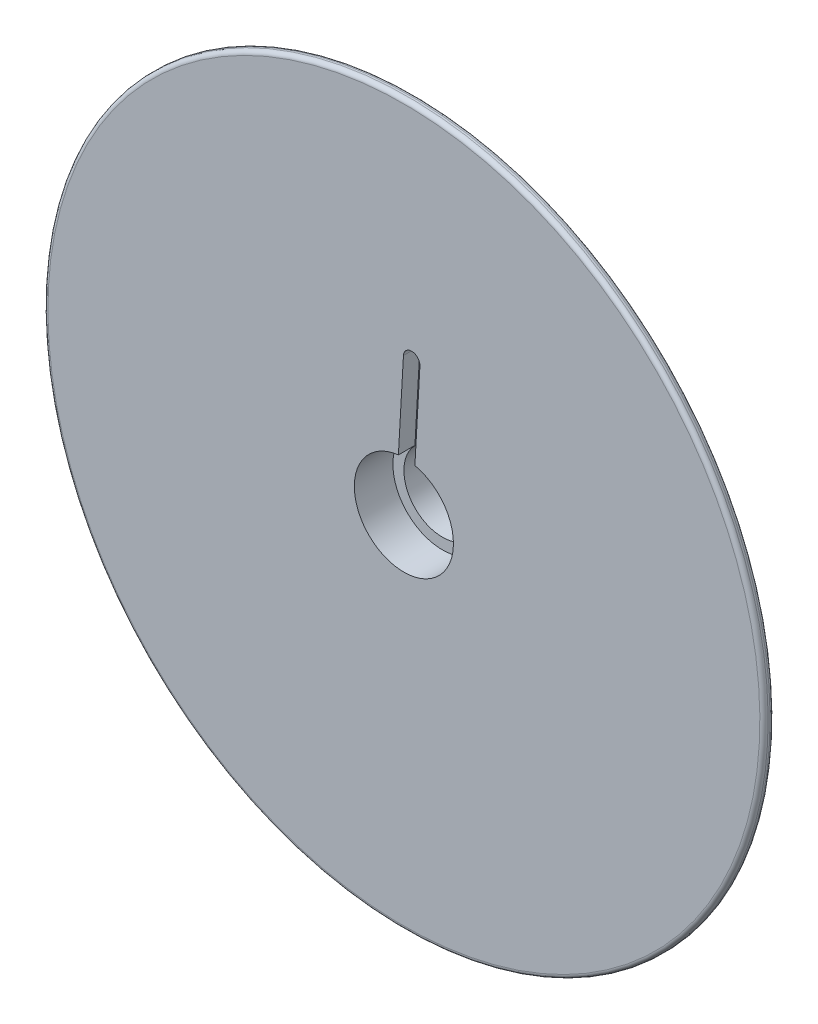
ISO-10303-21;
HEADER;
FILE_DESCRIPTION(('STEP AP214'),'2;1');
FILE_NAME('part.step','',(''),(''),'','','');
FILE_SCHEMA(('AUTOMOTIVE_DESIGN { 1 0 10303 214 1 1 1 1 }'));
ENDSEC;
DATA;
#1=APPLICATION_CONTEXT('core data for automotive mechanical design processes');
#2=APPLICATION_PROTOCOL_DEFINITION('international standard','automotive_design',2000,#1);
#3=PRODUCT_CONTEXT('',#1,'mechanical');
#4=PRODUCT('Part','Part','',(#3));
#5=PRODUCT_RELATED_PRODUCT_CATEGORY('part','',(#4));
#6=PRODUCT_DEFINITION_FORMATION('','',#4);
#7=PRODUCT_DEFINITION_CONTEXT('part definition',#1,'design');
#8=PRODUCT_DEFINITION('design','',#6,#7);
#9=PRODUCT_DEFINITION_SHAPE('','',#8);
#10=(LENGTH_UNIT() NAMED_UNIT(*) SI_UNIT(.MILLI.,.METRE.));
#11=(NAMED_UNIT(*) PLANE_ANGLE_UNIT() SI_UNIT($,.RADIAN.));
#12=(NAMED_UNIT(*) SI_UNIT($,.STERADIAN.) SOLID_ANGLE_UNIT());
#13=UNCERTAINTY_MEASURE_WITH_UNIT(LENGTH_MEASURE(1.E-05),#10,'distance_accuracy_value','');
#14=(GEOMETRIC_REPRESENTATION_CONTEXT(3) GLOBAL_UNCERTAINTY_ASSIGNED_CONTEXT((#13)) GLOBAL_UNIT_ASSIGNED_CONTEXT((#10,
#11,#12)) REPRESENTATION_CONTEXT('',''));
#15=CARTESIAN_POINT('',(0.,0.,0.));
#16=DIRECTION('',(0.,0.,1.));
#17=DIRECTION('',(1.,0.,0.));
#18=AXIS2_PLACEMENT_3D('',#15,#16,#17);
#19=CARTESIAN_POINT('',(60.,0.,69.));
#20=DIRECTION('',(0.,0.,-1.));
#21=DIRECTION('',(0.0567306240548655,0.998389521326394,0.));
#22=AXIS2_PLACEMENT_3D('',#19,#20,#21);
#23=CYLINDRICAL_SURFACE('',#22,7.);
#24=CARTESIAN_POINT('',(60.,0.,36.));
#25=DIRECTION('',(0.,0.,-1.));
#26=DIRECTION('',(0.0567306240548655,0.998389521326394,0.));
#27=AXIS2_PLACEMENT_3D('',#24,#25,#26);
#28=CIRCLE('',#27,7.);
#29=CARTESIAN_POINT('',(60.3971143683841,6.98872664928476,36.));
#30=VERTEX_POINT('',#29);
#31=EDGE_CURVE('E93',#30,#30,#28,.T.);
#32=ORIENTED_EDGE('',*,*,#31,.T.);
#33=EDGE_LOOP('',(#32));
#34=FACE_BOUND('',#33,.T.);
#35=CARTESIAN_POINT('',(60.,0.,51.));
#36=DIRECTION('',(0.,0.,1.));
#37=DIRECTION('',(-0.0567306240548655,-0.998389521326394,0.));
#38=AXIS2_PLACEMENT_3D('',#35,#36,#37);
#39=CIRCLE('',#38,7.);
#40=CARTESIAN_POINT('',(59.6028856316159,-6.98872664928476,51.));
#41=VERTEX_POINT('',#40);
#42=EDGE_CURVE('E98',#41,#41,#39,.F.);
#43=ORIENTED_EDGE('',*,*,#42,.F.);
#44=EDGE_LOOP('',(#43));
#45=FACE_BOUND('',#44,.T.);
#46=ADVANCED_FACE('F40',(#34,#45),#23,.F.);
#47=CARTESIAN_POINT('',(60.,0.,36.));
#48=DIRECTION('',(0.,0.,1.));
#49=DIRECTION('',(0.998389521326394,-0.0567306240548655,0.));
#50=AXIS2_PLACEMENT_3D('',#47,#48,#49);
#51=PLANE('',#50);
#52=ORIENTED_EDGE('',*,*,#31,.F.);
#53=EDGE_LOOP('',(#52));
#54=FACE_BOUND('',#53,.T.);
#55=CARTESIAN_POINT('',(60.,0.,36.));
#56=DIRECTION('',(0.,0.,1.));
#57=DIRECTION('',(0.998389521326394,-0.0567306240548655,0.));
#58=AXIS2_PLACEMENT_3D('',#55,#56,#57);
#59=CIRCLE('',#58,9.5);
#60=CARTESIAN_POINT('',(69.4847004526007,-0.538940928521224,36.));
#61=VERTEX_POINT('',#60);
#62=EDGE_CURVE('E109',#61,#61,#59,.T.);
#63=ORIENTED_EDGE('',*,*,#62,.F.);
#64=EDGE_LOOP('',(#63));
#65=FACE_BOUND('',#64,.T.);
#66=ADVANCED_FACE('F144',(#54,#65),#51,.F.);
#67=CARTESIAN_POINT('',(60.,0.,58.));
#68=DIRECTION('',(0.,0.,1.));
#69=DIRECTION('',(0.998389521326394,-0.0567306240548655,0.));
#70=AXIS2_PLACEMENT_3D('',#67,#68,#69);
#71=CYLINDRICAL_SURFACE('',#70,9.5);
#72=CARTESIAN_POINT('',(60.,0.,45.));
#73=DIRECTION('',(0.,0.,1.));
#74=DIRECTION('',(0.998389521326394,-0.0567306240548655,0.));
#75=AXIS2_PLACEMENT_3D('',#72,#73,#74);
#76=CIRCLE('',#75,9.5);
#77=CARTESIAN_POINT('',(69.4847004526008,-0.538940928521224,45.));
#78=VERTEX_POINT('',#77);
#79=EDGE_CURVE('E12',#78,#78,#76,.F.);
#80=ORIENTED_EDGE('',*,*,#79,.T.);
#81=EDGE_LOOP('',(#80));
#82=FACE_BOUND('',#81,.T.);
#83=ORIENTED_EDGE('',*,*,#62,.T.);
#84=EDGE_LOOP('',(#83));
#85=FACE_BOUND('',#84,.T.);
#86=ADVANCED_FACE('F150',(#82,#85),#71,.T.);
#87=CARTESIAN_POINT('',(60.5389409285212,9.48470045260074,53.));
#88=DIRECTION('',(0.,0.,1.));
#89=DIRECTION('',(0.998389521326394,-0.0567306240548655,0.));
#90=AXIS2_PLACEMENT_3D('',#87,#88,#89);
#91=PLANE('',#90);
#92=CARTESIAN_POINT('',(60.,0.,53.));
#93=DIRECTION('',(0.,0.,1.));
#94=DIRECTION('',(0.998389521326394,-0.0567306240548655,0.));
#95=AXIS2_PLACEMENT_3D('',#92,#93,#94);
#96=CIRCLE('',#95,39.5);
#97=CARTESIAN_POINT('',(99.4363860923926,-2.24085965016719,53.));
#98=VERTEX_POINT('',#97);
#99=EDGE_CURVE('E48',#98,#98,#96,.T.);
#100=ORIENTED_EDGE('',*,*,#99,.T.);
#101=EDGE_LOOP('',(#100));
#102=FACE_BOUND('',#101,.T.);
#103=CARTESIAN_POINT('',(60.,0.,53.));
#104=DIRECTION('',(0.,0.,1.));
#105=DIRECTION('',(0.998389521326394,-0.0567306240548655,0.));
#106=AXIS2_PLACEMENT_3D('',#103,#104,#105);
#107=CIRCLE('',#106,60.4);
#108=CARTESIAN_POINT('',(120.302727088114,-3.42652969291388,53.));
#109=VERTEX_POINT('',#108);
#110=EDGE_CURVE('E113',#109,#109,#107,.F.);
#111=ORIENTED_EDGE('',*,*,#110,.T.);
#112=EDGE_LOOP('',(#111));
#113=FACE_BOUND('',#112,.T.);
#114=ADVANCED_FACE('F131',(#102,#113),#91,.F.);
#115=CARTESIAN_POINT('',(60.,0.,58.));
#116=DIRECTION('',(0.,0.,1.));
#117=DIRECTION('',(0.998389521326394,-0.0567306240548655,0.));
#118=AXIS2_PLACEMENT_3D('',#115,#116,#117);
#119=CYLINDRICAL_SURFACE('',#118,65.4);
#120=CARTESIAN_POINT('',(60.,0.,57.25));
#121=DIRECTION('',(0.,0.,-1.));
#122=DIRECTION('',(-0.998389521326394,0.0567306240548655,0.));
#123=AXIS2_PLACEMENT_3D('',#120,#121,#122);
#124=CIRCLE('',#123,65.4);
#125=CARTESIAN_POINT('',(-5.29467469474616,3.7101828131882,57.25));
#126=VERTEX_POINT('',#125);
#127=EDGE_CURVE('E123',#126,#126,#124,.T.);
#128=ORIENTED_EDGE('',*,*,#127,.T.);
#129=EDGE_LOOP('',(#128));
#130=FACE_BOUND('',#129,.T.);
#131=CARTESIAN_POINT('',(60.,0.,56.89049167118));
#132=DIRECTION('',(0.,0.,-1.));
#133=DIRECTION('',(-0.998389521326394,0.0567306240548655,0.));
#134=AXIS2_PLACEMENT_3D('',#131,#132,#133);
#135=CIRCLE('',#134,65.4);
#136=CARTESIAN_POINT('',(-5.29467469474616,3.7101828131882,56.8904916711801));
#137=VERTEX_POINT('',#136);
#138=EDGE_CURVE('E120',#137,#137,#135,.F.);
#139=ORIENTED_EDGE('',*,*,#138,.T.);
#140=EDGE_LOOP('',(#139));
#141=FACE_BOUND('',#140,.T.);
#142=ADVANCED_FACE('F159',(#130,#141),#119,.T.);
#143=CARTESIAN_POINT('',(63.7101828131882,65.2946746947462,58.));
#144=DIRECTION('',(0.,0.,-1.));
#145=DIRECTION('',(-0.998389521326394,0.0567306240548655,0.));
#146=AXIS2_PLACEMENT_3D('',#143,#144,#145);
#147=PLANE('',#146);
#148=CARTESIAN_POINT('',(60.,0.,58.));
#149=DIRECTION('',(0.,0.,-1.));
#150=DIRECTION('',(-0.998389521326394,0.0567306240548655,0.));
#151=AXIS2_PLACEMENT_3D('',#148,#149,#150);
#152=CIRCLE('',#151,64.65);
#153=CARTESIAN_POINT('',(-4.54588255375136,3.66763484514705,58.));
#154=VERTEX_POINT('',#153);
#155=EDGE_CURVE('E117',#154,#154,#152,.F.);
#156=ORIENTED_EDGE('',*,*,#155,.T.);
#157=EDGE_LOOP('',(#156));
#158=FACE_BOUND('',#157,.T.);
#159=DIRECTION('',(0.0567306240548654,0.998389521326394,0.));
#160=VECTOR('',#159,1.);
#161=CARTESIAN_POINT('',(62.9158498833612,24.8746420970775,58.));
#162=LINE('',#161,#160);
#163=CARTESIAN_POINT('',(62.00101862907,8.77473215808407,58.));
#164=VERTEX_POINT('',#163);
#165=CARTESIAN_POINT('',(62.9158498833612,24.8746420970775,58.));
#166=VERTEX_POINT('',#165);
#167=EDGE_CURVE('E76',#164,#166,#162,.T.);
#168=ORIENTED_EDGE('',*,*,#167,.F.);
#169=CARTESIAN_POINT('',(60.,0.,58.));
#170=DIRECTION('',(0.,0.,1.));
#171=DIRECTION('',(-0.0567306240548655,-0.998389521326394,0.));
#172=AXIS2_PLACEMENT_3D('',#169,#170,#171);
#173=CIRCLE('',#172,9.);
#174=CARTESIAN_POINT('',(59.0058500650908,8.94492403024867,58.));
#175=VERTEX_POINT('',#174);
#176=EDGE_CURVE('E336',#175,#164,#173,.T.);
#177=ORIENTED_EDGE('',*,*,#176,.F.);
#178=DIRECTION('',(-0.0567306240548654,-0.998389521326394,0.));
#179=VECTOR('',#178,1.);
#180=CARTESIAN_POINT('',(59.9206813193821,25.0448339692421,58.));
#181=LINE('',#180,#179);
#182=CARTESIAN_POINT('',(59.9206813193821,25.0448339692421,58.));
#183=VERTEX_POINT('',#182);
#184=EDGE_CURVE('E86',#183,#175,#181,.T.);
#185=ORIENTED_EDGE('',*,*,#184,.F.);
#186=CARTESIAN_POINT('',(61.4182656013716,24.9597380331598,58.));
#187=DIRECTION('',(0.,0.,1.));
#188=DIRECTION('',(-0.0567306240548655,-0.998389521326394,0.));
#189=AXIS2_PLACEMENT_3D('',#186,#187,#188);
#190=CIRCLE('',#189,1.5);
#191=EDGE_CURVE('E91',#166,#183,#190,.T.);
#192=ORIENTED_EDGE('',*,*,#191,.F.);
#193=EDGE_LOOP('',(#168,#177,#185,#192));
#194=FACE_BOUND('',#193,.T.);
#195=ADVANCED_FACE('F96',(#158,#194),#147,.F.);
#196=CARTESIAN_POINT('',(62.9158498833612,24.8746420970775,55.));
#197=DIRECTION('',(0.998389521326394,-0.0567306240548653,0.));
#198=DIRECTION('',(-0.0567306240548654,-0.998389521326394,0.));
#199=AXIS2_PLACEMENT_3D('',#196,#197,#198);
#200=PLANE('',#199);
#201=DIRECTION('',(0.0567306240548654,0.998389521326394,0.));
#202=VECTOR('',#201,1.);
#203=CARTESIAN_POINT('',(62.9158498833612,24.8746420970775,55.));
#204=LINE('',#203,#202);
#205=CARTESIAN_POINT('',(62.00101862907,8.77473215808407,55.));
#206=VERTEX_POINT('',#205);
#207=CARTESIAN_POINT('',(62.9158498833612,24.8746420970775,55.));
#208=VERTEX_POINT('',#207);
#209=EDGE_CURVE('E63',#206,#208,#204,.T.);
#210=ORIENTED_EDGE('',*,*,#209,.F.);
#211=DIRECTION('',(0.,0.,1.));
#212=VECTOR('',#211,1.);
#213=CARTESIAN_POINT('',(62.00101862907,8.77473215808407,51.));
#214=LINE('',#213,#212);
#215=EDGE_CURVE('E55',#206,#164,#214,.T.);
#216=ORIENTED_EDGE('',*,*,#215,.T.);
#217=ORIENTED_EDGE('',*,*,#167,.T.);
#218=DIRECTION('',(0.,0.,1.));
#219=VECTOR('',#218,1.);
#220=CARTESIAN_POINT('',(62.9158498833612,24.8746420970775,55.));
#221=LINE('',#220,#219);
#222=EDGE_CURVE('E79',#208,#166,#221,.T.);
#223=ORIENTED_EDGE('',*,*,#222,.F.);
#224=EDGE_LOOP('',(#210,#216,#217,#223));
#225=FACE_BOUND('',#224,.T.);
#226=ADVANCED_FACE('F78',(#225),#200,.F.);
#227=CARTESIAN_POINT('',(59.9206813193821,25.0448339692421,55.));
#228=DIRECTION('',(-0.998389521326394,0.0567306240548653,0.));
#229=DIRECTION('',(0.0567306240548654,0.998389521326394,0.));
#230=AXIS2_PLACEMENT_3D('',#227,#228,#229);
#231=PLANE('',#230);
#232=ORIENTED_EDGE('',*,*,#184,.T.);
#233=DIRECTION('',(0.,0.,1.));
#234=VECTOR('',#233,1.);
#235=CARTESIAN_POINT('',(59.0058500650908,8.94492403024867,51.));
#236=LINE('',#235,#234);
#237=CARTESIAN_POINT('',(59.0058500650908,8.94492403024867,55.));
#238=VERTEX_POINT('',#237);
#239=EDGE_CURVE('E328',#175,#238,#236,.F.);
#240=ORIENTED_EDGE('',*,*,#239,.T.);
#241=DIRECTION('',(-0.0567306240548654,-0.998389521326394,0.));
#242=VECTOR('',#241,1.);
#243=CARTESIAN_POINT('',(59.9206813193821,25.0448339692421,55.));
#244=LINE('',#243,#242);
#245=CARTESIAN_POINT('',(59.9206813193821,25.0448339692421,55.));
#246=VERTEX_POINT('',#245);
#247=EDGE_CURVE('E331',#246,#238,#244,.T.);
#248=ORIENTED_EDGE('',*,*,#247,.F.);
#249=DIRECTION('',(0.,0.,1.));
#250=VECTOR('',#249,1.);
#251=CARTESIAN_POINT('',(59.9206813193821,25.0448339692421,55.));
#252=LINE('',#251,#250);
#253=EDGE_CURVE('E94',#246,#183,#252,.T.);
#254=ORIENTED_EDGE('',*,*,#253,.T.);
#255=EDGE_LOOP('',(#232,#240,#248,#254));
#256=FACE_BOUND('',#255,.T.);
#257=ADVANCED_FACE('F247',(#256),#231,.F.);
#258=CARTESIAN_POINT('',(61.4182656013716,24.9597380331598,55.));
#259=DIRECTION('',(0.,0.,1.));
#260=DIRECTION('',(-0.0567306240548655,-0.998389521326394,0.));
#261=AXIS2_PLACEMENT_3D('',#258,#259,#260);
#262=PLANE('',#261);
#263=CARTESIAN_POINT('',(60.,0.,55.));
#264=DIRECTION('',(0.,0.,1.));
#265=DIRECTION('',(-0.0567306240548655,-0.998389521326394,0.));
#266=AXIS2_PLACEMENT_3D('',#263,#264,#265);
#267=CIRCLE('',#266,9.);
#268=EDGE_CURVE('E112',#206,#238,#267,.T.);
#269=ORIENTED_EDGE('',*,*,#268,.F.);
#270=ORIENTED_EDGE('',*,*,#209,.T.);
#271=CARTESIAN_POINT('',(61.4182656013716,24.9597380331598,55.));
#272=DIRECTION('',(0.,0.,1.));
#273=DIRECTION('',(-0.0567306240548655,-0.998389521326394,0.));
#274=AXIS2_PLACEMENT_3D('',#271,#272,#273);
#275=CIRCLE('',#274,1.5);
#276=EDGE_CURVE('E85',#208,#246,#275,.T.);
#277=ORIENTED_EDGE('',*,*,#276,.T.);
#278=ORIENTED_EDGE('',*,*,#247,.T.);
#279=EDGE_LOOP('',(#269,#270,#277,#278));
#280=FACE_BOUND('',#279,.T.);
#281=ADVANCED_FACE('F255',(#280),#262,.T.);
#282=CARTESIAN_POINT('',(61.4182656013716,24.9597380331598,55.));
#283=DIRECTION('',(0.,0.,1.));
#284=DIRECTION('',(-0.0567306240548655,-0.998389521326394,0.));
#285=AXIS2_PLACEMENT_3D('',#282,#283,#284);
#286=CYLINDRICAL_SURFACE('',#285,1.5);
#287=ORIENTED_EDGE('',*,*,#191,.T.);
#288=ORIENTED_EDGE('',*,*,#253,.F.);
#289=ORIENTED_EDGE('',*,*,#276,.F.);
#290=ORIENTED_EDGE('',*,*,#222,.T.);
#291=EDGE_LOOP('',(#287,#288,#289,#290));
#292=FACE_BOUND('',#291,.T.);
#293=ADVANCED_FACE('F90',(#292),#286,.F.);
#294=CARTESIAN_POINT('',(60.,0.,51.));
#295=DIRECTION('',(0.,0.,1.));
#296=DIRECTION('',(-0.0567306240548655,-0.998389521326394,0.));
#297=AXIS2_PLACEMENT_3D('',#294,#295,#296);
#298=PLANE('',#297);
#299=CARTESIAN_POINT('',(60.,0.,51.));
#300=DIRECTION('',(0.,0.,1.));
#301=DIRECTION('',(-0.0567306240548655,-0.998389521326394,0.));
#302=AXIS2_PLACEMENT_3D('',#299,#300,#301);
#303=CIRCLE('',#302,9.);
#304=CARTESIAN_POINT('',(59.4894243835062,-8.98550569193755,51.));
#305=VERTEX_POINT('',#304);
#306=EDGE_CURVE('E324',#305,#305,#303,.T.);
#307=ORIENTED_EDGE('',*,*,#306,.T.);
#308=EDGE_LOOP('',(#307));
#309=FACE_BOUND('',#308,.T.);
#310=ORIENTED_EDGE('',*,*,#42,.T.);
#311=EDGE_LOOP('',(#310));
#312=FACE_BOUND('',#311,.T.);
#313=ADVANCED_FACE('F272',(#309,#312),#298,.T.);
#314=CARTESIAN_POINT('',(60.,0.,51.));
#315=DIRECTION('',(0.,0.,1.));
#316=DIRECTION('',(-0.0567306240548655,-0.998389521326394,0.));
#317=AXIS2_PLACEMENT_3D('',#314,#315,#316);
#318=CYLINDRICAL_SURFACE('',#317,9.);
#319=ORIENTED_EDGE('',*,*,#306,.F.);
#320=EDGE_LOOP('',(#319));
#321=FACE_BOUND('',#320,.T.);
#322=ORIENTED_EDGE('',*,*,#268,.T.);
#323=ORIENTED_EDGE('',*,*,#239,.F.);
#324=ORIENTED_EDGE('',*,*,#176,.T.);
#325=ORIENTED_EDGE('',*,*,#215,.F.);
#326=EDGE_LOOP('',(#322,#323,#324,#325));
#327=FACE_BOUND('',#326,.T.);
#328=ADVANCED_FACE('F172',(#321,#327),#318,.F.);
#329=CARTESIAN_POINT('',(60.,0.,56.5));
#330=DIRECTION('',(0.,0.,1.));
#331=DIRECTION('',(0.998389521326394,-0.0567306240548655,0.));
#332=AXIS2_PLACEMENT_3D('',#329,#330,#331);
#333=CONICAL_SURFACE('',#332,65.4,0.960070362405689);
#334=CARTESIAN_POINT('',(60.,0.,56.2760677307908));
#335=DIRECTION('',(0.,0.,1.));
#336=DIRECTION('',(0.998389521326394,-0.0567306240548655,0.));
#337=AXIS2_PLACEMENT_3D('',#334,#335,#336);
#338=CIRCLE('',#337,65.0800967582725);
#339=CARTESIAN_POINT('',(124.975286650367,-3.69203450264783,56.2760677307908));
#340=VERTEX_POINT('',#339);
#341=EDGE_CURVE('E126',#340,#340,#338,.F.);
#342=CARTESIAN_POINT('',(124.975286650367,-3.69203450264783,56.2760677307908));
#343=CARTESIAN_POINT('',(124.926614154927,-3.68926882754643,56.2419420252617));
#344=CARTESIAN_POINT('',(124.877941659487,-3.68650315244504,56.2078163197326));
#345=CARTESIAN_POINT('',(124.780596668607,-3.68097180224225,56.1395649086745));
#346=CARTESIAN_POINT('',(124.731924173166,-3.67820612714085,56.1054392031454));
#347=CARTESIAN_POINT('',(124.634579182286,-3.67267477693806,56.0371877920873));
#348=CARTESIAN_POINT('',(124.585906686846,-3.66990910183667,56.0030620865582));
#349=CARTESIAN_POINT('',(124.488561695966,-3.66437775163388,55.9348106755001));
#350=CARTESIAN_POINT('',(124.439889200526,-3.66161207653248,55.900684969971));
#351=CARTESIAN_POINT('',(124.342544209645,-3.65608072632969,55.8324335589128));
#352=CARTESIAN_POINT('',(124.293871714205,-3.65331505122829,55.7983078533838));
#353=CARTESIAN_POINT('',(124.196526723325,-3.6477837010255,55.7300564423256));
#354=CARTESIAN_POINT('',(124.147854227885,-3.64501802592411,55.6959307367966));
#355=CARTESIAN_POINT('',(124.050509237005,-3.63948667572132,55.6276793257384));
#356=CARTESIAN_POINT('',(124.001836741564,-3.63672100061992,55.5935536202094));
#357=CARTESIAN_POINT('',(123.904491750684,-3.63118965041713,55.5253022091512));
#358=CARTESIAN_POINT('',(123.855819255244,-3.62842397531574,55.4911765036221));
#359=CARTESIAN_POINT('',(123.758474264364,-3.62289262511294,55.422925092564));
#360=CARTESIAN_POINT('',(123.709801768924,-3.62012695001155,55.3887993870349));
#361=CARTESIAN_POINT('',(123.612456778043,-3.61459559980876,55.3205479759768));
#362=CARTESIAN_POINT('',(123.563784282603,-3.61182992470736,55.2864222704477));
#363=CARTESIAN_POINT('',(123.466439291723,-3.60629857450457,55.2181708593896));
#364=CARTESIAN_POINT('',(123.417766796283,-3.60353289940318,55.1840451538605));
#365=CARTESIAN_POINT('',(123.320421805403,-3.59800154920039,55.1157937428024));
#366=CARTESIAN_POINT('',(123.271749309962,-3.59523587409899,55.0816680372733));
#367=CARTESIAN_POINT('',(123.174404319082,-3.5897045238962,55.0134166262152));
#368=CARTESIAN_POINT('',(123.125731823642,-3.58693884879481,54.9792909206861));
#369=CARTESIAN_POINT('',(123.028386832762,-3.58140749859201,54.9110395096279));
#370=CARTESIAN_POINT('',(122.979714337322,-3.57864182349062,54.8769138040989));
#371=CARTESIAN_POINT('',(122.882369346441,-3.57311047328783,54.8086623930407));
#372=CARTESIAN_POINT('',(122.833696851001,-3.57034479818643,54.7745366875117));
#373=CARTESIAN_POINT('',(122.736351860121,-3.56481344798364,54.7062852764535));
#374=CARTESIAN_POINT('',(122.687679364681,-3.56204777288225,54.6721595709244));
#375=CARTESIAN_POINT('',(122.590334373801,-3.55651642267946,54.6039081598663));
#376=CARTESIAN_POINT('',(122.54166187836,-3.55375074757806,54.5697824543372));
#377=CARTESIAN_POINT('',(122.44431688748,-3.54821939737527,54.5015310432791));
#378=CARTESIAN_POINT('',(122.39564439204,-3.54545372227388,54.46740533775));
#379=CARTESIAN_POINT('',(122.29829940116,-3.53992237207108,54.3991539266919));
#380=CARTESIAN_POINT('',(122.24962690572,-3.53715669696969,54.3650282211628));
#381=CARTESIAN_POINT('',(122.152281914839,-3.5316253467669,54.2967768101047));
#382=CARTESIAN_POINT('',(122.103609419399,-3.5288596716655,54.2626511045756));
#383=CARTESIAN_POINT('',(122.006264428519,-3.52332832146271,54.1943996935175));
#384=CARTESIAN_POINT('',(121.957591933079,-3.52056264636132,54.1602739879884));
#385=CARTESIAN_POINT('',(121.860246942198,-3.51503129615853,54.0920225769303));
#386=CARTESIAN_POINT('',(121.811574446758,-3.51226562105713,54.0578968714012));
#387=CARTESIAN_POINT('',(121.714229455878,-3.50673427085434,53.989645460343));
#388=CARTESIAN_POINT('',(121.665556960438,-3.50396859575294,53.955519754814));
#389=CARTESIAN_POINT('',(121.568211969558,-3.49843724555015,53.8872683437558));
#390=CARTESIAN_POINT('',(121.519539474118,-3.49567157044876,53.8531426382268));
#391=CARTESIAN_POINT('',(121.422194483237,-3.49014022024597,53.7848912271686));
#392=CARTESIAN_POINT('',(121.373521987797,-3.48737454514457,53.7507655216396));
#393=CARTESIAN_POINT('',(121.276176996917,-3.48184319494178,53.6825141105814));
#394=CARTESIAN_POINT('',(121.227504501477,-3.47907751984039,53.6483884050523));
#395=CARTESIAN_POINT('',(121.130159510596,-3.4735461696376,53.5801369939942));
#396=CARTESIAN_POINT('',(121.081487015156,-3.4707804945362,53.5460112884651));
#397=CARTESIAN_POINT('',(120.984142024276,-3.46524914433341,53.477759877407));
#398=CARTESIAN_POINT('',(120.935469528836,-3.46248346923201,53.4436341718779));
#399=CARTESIAN_POINT('',(120.838124537956,-3.45695211902922,53.3753827608198));
#400=CARTESIAN_POINT('',(120.789452042516,-3.45418644392783,53.3412570552907));
#401=CARTESIAN_POINT('',(120.692107051635,-3.44865509372504,53.2730056442326));
#402=CARTESIAN_POINT('',(120.643434556195,-3.44588941862364,53.2388799387035));
#403=CARTESIAN_POINT('',(120.546089565315,-3.44035806842085,53.1706285276454));
#404=CARTESIAN_POINT('',(120.497417069875,-3.43759239331946,53.1365028221163));
#405=CARTESIAN_POINT('',(120.400072078994,-3.43206104311667,53.0682514110581));
#406=CARTESIAN_POINT('',(120.351399583554,-3.42929536801527,53.0341257055291));
#407=CARTESIAN_POINT('',(120.302727088114,-3.42652969291388,53.));
#408=B_SPLINE_CURVE_WITH_KNOTS('',3,(#342,#343,#344,#345,#346,#347,#348,#349,#350,#351,#352,
#353,#354,#355,#356,#357,#358,#359,#360,#361,#362,#363,#364,#365,#366,#367,#368,#369,#370,#371,
#372,#373,#374,#375,#376,#377,#378,#379,#380,#381,#382,#383,#384,#385,#386,#387,#388,#389,#390,
#391,#392,#393,#394,#395,#396,#397,#398,#399,#400,#401,#402,#403,#404,#405,#406,#407),
.UNSPECIFIED.,.F.,.F.,(4,2,2,2,2,2,2,2,2,2,2,2,2,2,2,2,2,2,2,2,2,2,2,2,2,2,2,2,2,2,2,2,4),(0.,
0.178524566771461,0.357049133542945,0.535573700314407,0.714098267085868,0.892622833857329,
1.07114740062881,1.24967196740027,1.42819653417173,1.60672110094319,1.78524566771465,
1.96377023448611,2.1422948012576,2.32081936802906,2.49934393480052,2.67786850157198,
2.85639306834344,3.0349176351149,3.21344220188637,3.39196676865784,3.5704913354293,
3.74901590220076,3.92754046897223,4.10606503574369,4.28458960251516,4.46311416928663,
4.64163873605809,4.82016330282955,4.99868786960102,5.17721243637248,5.35573700314395,
5.53426156991541,5.71278613668688),.UNSPECIFIED.);
#409=EDGE_CURVE('BSEAM169',#340,#109,#408,.T.);
#410=ORIENTED_EDGE('',*,*,#341,.T.);
#411=ORIENTED_EDGE('',*,*,#110,.F.);
#412=ORIENTED_EDGE('',*,*,#409,.T.);
#413=ORIENTED_EDGE('',*,*,#409,.F.);
#414=EDGE_LOOP('',(#410,#412,#411,#413));
#415=FACE_BOUND('',#414,.T.);
#416=ADVANCED_FACE('F169',(#415),#333,.T.);
#417=CARTESIAN_POINT('',(60.,0.,57.25));
#418=DIRECTION('',(0.,0.,-1.));
#419=DIRECTION('',(-0.998389521326394,0.0567306240548655,0.));
#420=AXIS2_PLACEMENT_3D('',#417,#418,#419);
#421=TOROIDAL_SURFACE('',#420,64.65,0.75);
#422=ORIENTED_EDGE('',*,*,#127,.F.);
#423=EDGE_LOOP('',(#422));
#424=FACE_BOUND('',#423,.T.);
#425=ORIENTED_EDGE('',*,*,#155,.F.);
#426=EDGE_LOOP('',(#425));
#427=FACE_BOUND('',#426,.T.);
#428=ADVANCED_FACE('F140',(#424,#427),#421,.T.);
#429=CARTESIAN_POINT('',(60.,0.,56.89049167118));
#430=DIRECTION('',(0.,0.,-1.));
#431=DIRECTION('',(-0.998389521326394,0.0567306240548655,0.));
#432=AXIS2_PLACEMENT_3D('',#429,#430,#431);
#433=TOROIDAL_SURFACE('',#432,64.65,0.75);
#434=ORIENTED_EDGE('',*,*,#341,.F.);
#435=EDGE_LOOP('',(#434));
#436=FACE_BOUND('',#435,.T.);
#437=ORIENTED_EDGE('',*,*,#138,.F.);
#438=EDGE_LOOP('',(#437));
#439=FACE_BOUND('',#438,.T.);
#440=ADVANCED_FACE('F135',(#436,#439),#433,.T.);
#441=CARTESIAN_POINT('',(60.,0.,53.));
#442=DIRECTION('',(0.,0.,1.));
#443=DIRECTION('',(0.998389521326394,-0.0567306240548655,0.));
#444=AXIS2_PLACEMENT_3D('',#441,#442,#443);
#445=CONICAL_SURFACE('',#444,39.5,1.31019393504756);
#446=CARTESIAN_POINT('',(69.4847004526008,-0.538940928521224,45.));
#447=CARTESIAN_POINT('',(69.7966971780153,-0.556669248538369,45.0833333333333));
#448=CARTESIAN_POINT('',(70.1086939034298,-0.574397568555515,45.1666666666667));
#449=CARTESIAN_POINT('',(70.7326873542587,-0.609854208589806,45.3333333333333));
#450=CARTESIAN_POINT('',(71.0446840796732,-0.627582528606952,45.4166666666667));
#451=CARTESIAN_POINT('',(71.6686775305022,-0.663039168641242,45.5833333333333));
#452=CARTESIAN_POINT('',(71.9806742559167,-0.680767488658388,45.6666666666667));
#453=CARTESIAN_POINT('',(72.6046677067457,-0.716224128692679,45.8333333333333));
#454=CARTESIAN_POINT('',(72.9166644321602,-0.733952448709824,45.9166666666667));
#455=CARTESIAN_POINT('',(73.5406578829892,-0.769409088744115,46.0833333333333));
#456=CARTESIAN_POINT('',(73.8526546084037,-0.787137408761261,46.1666666666667));
#457=CARTESIAN_POINT('',(74.4766480592327,-0.822594048795552,46.3333333333333));
#458=CARTESIAN_POINT('',(74.7886447846472,-0.840322368812697,46.4166666666667));
#459=CARTESIAN_POINT('',(75.4126382354762,-0.875779008846988,46.5833333333333));
#460=CARTESIAN_POINT('',(75.7246349608907,-0.893507328864133,46.6666666666667));
#461=CARTESIAN_POINT('',(76.3486284117197,-0.928963968898424,46.8333333333333));
#462=CARTESIAN_POINT('',(76.6606251371342,-0.94669228891557,46.9166666666667));
#463=CARTESIAN_POINT('',(77.2846185879632,-0.982148928949861,47.0833333333333));
#464=CARTESIAN_POINT('',(77.5966153133777,-0.999877248967006,47.1666666666667));
#465=CARTESIAN_POINT('',(78.2206087642067,-1.0353338890013,47.3333333333333));
#466=CARTESIAN_POINT('',(78.5326054896212,-1.05306220901844,47.4166666666667));
#467=CARTESIAN_POINT('',(79.1565989404502,-1.08851884905273,47.5833333333333));
#468=CARTESIAN_POINT('',(79.4685956658647,-1.10624716906988,47.6666666666667));
#469=CARTESIAN_POINT('',(80.0925891166937,-1.14170380910417,47.8333333333333));
#470=CARTESIAN_POINT('',(80.4045858421082,-1.15943212912132,47.9166666666667));
#471=CARTESIAN_POINT('',(81.0285792929372,-1.19488876915561,48.0833333333333));
#472=CARTESIAN_POINT('',(81.3405760183517,-1.21261708917275,48.1666666666667));
#473=CARTESIAN_POINT('',(81.9645694691807,-1.24807372920704,48.3333333333333));
#474=CARTESIAN_POINT('',(82.2765661945952,-1.26580204922419,48.4166666666667));
#475=CARTESIAN_POINT('',(82.9005596454242,-1.30125868925848,48.5833333333333));
#476=CARTESIAN_POINT('',(83.2125563708387,-1.31898700927562,48.6666666666667));
#477=CARTESIAN_POINT('',(83.8365498216677,-1.35444364930992,48.8333333333333));
#478=CARTESIAN_POINT('',(84.1485465470822,-1.37217196932706,48.9166666666667));
#479=CARTESIAN_POINT('',(84.7725399979112,-1.40762860936135,49.0833333333333));
#480=CARTESIAN_POINT('',(85.0845367233257,-1.4253569293785,49.1666666666667));
#481=CARTESIAN_POINT('',(85.7085301741547,-1.46081356941279,49.3333333333333));
#482=CARTESIAN_POINT('',(86.0205268995691,-1.47854188942993,49.4166666666667));
#483=CARTESIAN_POINT('',(86.6445203503981,-1.51399852946422,49.5833333333333));
#484=CARTESIAN_POINT('',(86.9565170758126,-1.53172684948137,49.6666666666667));
#485=CARTESIAN_POINT('',(87.5805105266416,-1.56718348951566,49.8333333333333));
#486=CARTESIAN_POINT('',(87.8925072520561,-1.58491180953281,49.9166666666667));
#487=CARTESIAN_POINT('',(88.5165007028851,-1.6203684495671,50.0833333333333));
#488=CARTESIAN_POINT('',(88.8284974282996,-1.63809676958424,50.1666666666667));
#489=CARTESIAN_POINT('',(89.4524908791286,-1.67355340961853,50.3333333333333));
#490=CARTESIAN_POINT('',(89.7644876045431,-1.69128172963568,50.4166666666667));
#491=CARTESIAN_POINT('',(90.3884810553721,-1.72673836966997,50.5833333333333));
#492=CARTESIAN_POINT('',(90.7004777807866,-1.74446668968712,50.6666666666667));
#493=CARTESIAN_POINT('',(91.3244712316156,-1.77992332972141,50.8333333333333));
#494=CARTESIAN_POINT('',(91.6364679570301,-1.79765164973855,50.9166666666667));
#495=CARTESIAN_POINT('',(92.2604614078591,-1.83310828977284,51.0833333333333));
#496=CARTESIAN_POINT('',(92.5724581332736,-1.85083660978999,51.1666666666667));
#497=CARTESIAN_POINT('',(93.1964515841026,-1.88629324982428,51.3333333333333));
#498=CARTESIAN_POINT('',(93.5084483095171,-1.90402156984142,51.4166666666667));
#499=CARTESIAN_POINT('',(94.1324417603461,-1.93947820987572,51.5833333333333));
#500=CARTESIAN_POINT('',(94.4444384857606,-1.95720652989286,51.6666666666667));
#501=CARTESIAN_POINT('',(95.0684319365896,-1.99266316992715,51.8333333333333));
#502=CARTESIAN_POINT('',(95.3804286620041,-2.0103914899443,51.9166666666667));
#503=CARTESIAN_POINT('',(96.0044221128331,-2.04584812997859,52.0833333333333));
#504=CARTESIAN_POINT('',(96.3164188382476,-2.06357644999573,52.1666666666667));
#505=CARTESIAN_POINT('',(96.9404122890766,-2.09903309003002,52.3333333333333));
#506=CARTESIAN_POINT('',(97.2524090144911,-2.11676141004717,52.4166666666667));
#507=CARTESIAN_POINT('',(97.8764024653201,-2.15221805008146,52.5833333333333));
#508=CARTESIAN_POINT('',(98.1883991907346,-2.16994637009861,52.6666666666667));
#509=CARTESIAN_POINT('',(98.8123926415636,-2.2054030101329,52.8333333333333));
#510=CARTESIAN_POINT('',(99.1243893669781,-2.22313133015004,52.9166666666667));
#511=CARTESIAN_POINT('',(99.4363860923926,-2.24085965016719,53.));
#512=B_SPLINE_CURVE_WITH_KNOTS('',3,(#446,#447,#448,#449,#450,#451,#452,#453,#454,#455,#456,
#457,#458,#459,#460,#461,#462,#463,#464,#465,#466,#467,#468,#469,#470,#471,#472,#473,#474,#475,
#476,#477,#478,#479,#480,#481,#482,#483,#484,#485,#486,#487,#488,#489,#490,#491,#492,#493,#494,
#495,#496,#497,#498,#499,#500,#501,#502,#503,#504,#505,#506,#507,#508,#509,#510,#511),
.UNSPECIFIED.,.F.,.F.,(4,2,2,2,2,2,2,2,2,2,2,2,2,2,2,2,2,2,2,2,2,2,2,2,2,2,2,2,2,2,2,2,4),(0.,
0.970260918516247,1.94052183703249,2.91078275554875,3.881043674065,4.85130459258125,
5.82156551109749,6.79182642961376,7.76208734813,8.73234826664626,9.70260918516251,
10.6728701036788,11.643131022195,12.6133919407113,13.5836528592275,14.5539137777438,
15.52417469626,16.4944356147763,17.4646965332925,18.4349574518088,19.405218370325,
20.3754792888413,21.3457402073575,22.3160011258738,23.28626204439,24.2565229629063,
25.2267838814225,26.1970447999388,27.167305718455,28.1375666369713,29.1078275554875,
30.0780884740038,31.04834939252),.UNSPECIFIED.);
#513=EDGE_CURVE('BSEAM42',#78,#98,#512,.T.);
#514=ORIENTED_EDGE('',*,*,#79,.F.);
#515=ORIENTED_EDGE('',*,*,#99,.F.);
#516=ORIENTED_EDGE('',*,*,#513,.T.);
#517=ORIENTED_EDGE('',*,*,#513,.F.);
#518=EDGE_LOOP('',(#514,#516,#515,#517));
#519=FACE_BOUND('',#518,.T.);
#520=ADVANCED_FACE('F42',(#519),#445,.T.);
#521=CLOSED_SHELL('',(#46,#66,#86,#114,#142,#195,#226,#257,#281,#293,#313,#328,#416,#428,#440,#520));
#522=MANIFOLD_SOLID_BREP('B2',#521);
#523=ADVANCED_BREP_SHAPE_REPRESENTATION('',(#18,#522),#14);
#524=SHAPE_DEFINITION_REPRESENTATION(#9,#523);
ENDSEC;
END-ISO-10303-21;
